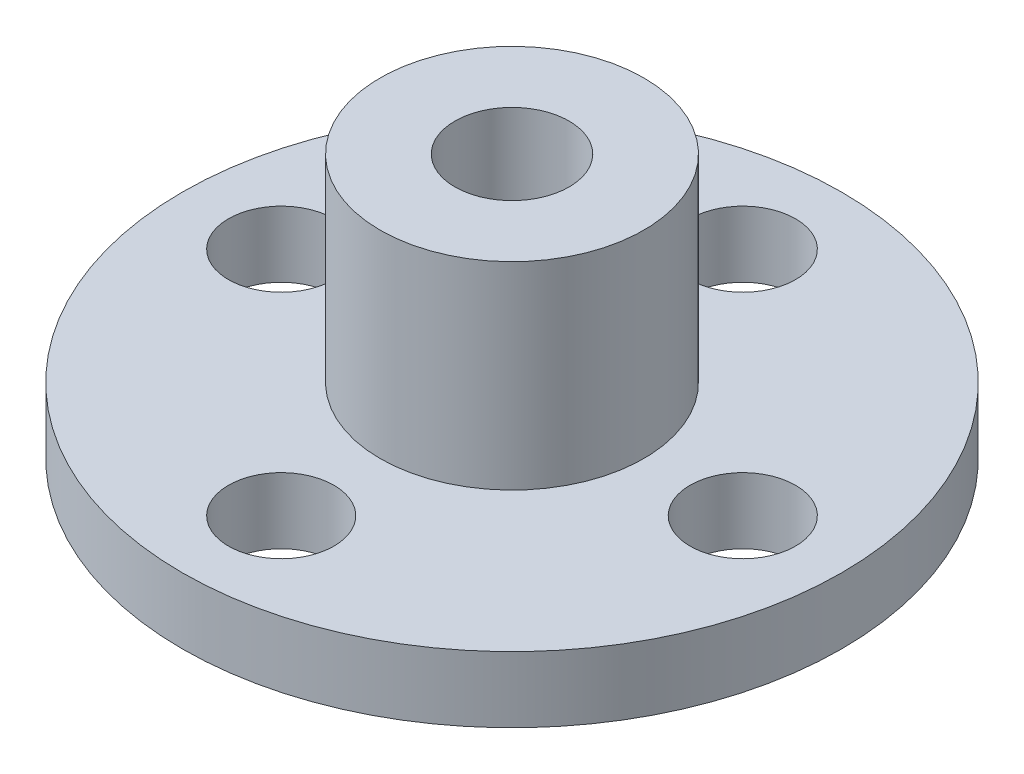
ISO-10303-21;
HEADER;
FILE_DESCRIPTION(('STEP AP214'),'2;1');
FILE_NAME('part.step','',(''),(''),'','','');
FILE_SCHEMA(('AUTOMOTIVE_DESIGN { 1 0 10303 214 1 1 1 1 }'));
ENDSEC;
DATA;
#1=APPLICATION_CONTEXT('core data for automotive mechanical design processes');
#2=APPLICATION_PROTOCOL_DEFINITION('international standard','automotive_design',2000,#1);
#3=PRODUCT_CONTEXT('',#1,'mechanical');
#4=PRODUCT('Part','Part','',(#3));
#5=PRODUCT_RELATED_PRODUCT_CATEGORY('part','',(#4));
#6=PRODUCT_DEFINITION_FORMATION('','',#4);
#7=PRODUCT_DEFINITION_CONTEXT('part definition',#1,'design');
#8=PRODUCT_DEFINITION('design','',#6,#7);
#9=PRODUCT_DEFINITION_SHAPE('','',#8);
#10=(LENGTH_UNIT() NAMED_UNIT(*) SI_UNIT(.MILLI.,.METRE.));
#11=(NAMED_UNIT(*) PLANE_ANGLE_UNIT() SI_UNIT($,.RADIAN.));
#12=(NAMED_UNIT(*) SI_UNIT($,.STERADIAN.) SOLID_ANGLE_UNIT());
#13=UNCERTAINTY_MEASURE_WITH_UNIT(LENGTH_MEASURE(1.E-05),#10,'distance_accuracy_value','');
#14=(GEOMETRIC_REPRESENTATION_CONTEXT(3) GLOBAL_UNCERTAINTY_ASSIGNED_CONTEXT((#13)) GLOBAL_UNIT_ASSIGNED_CONTEXT((#10,
#11,#12)) REPRESENTATION_CONTEXT('',''));
#15=CARTESIAN_POINT('',(0.,0.,0.));
#16=DIRECTION('',(0.,0.,1.));
#17=DIRECTION('',(1.,0.,0.));
#18=AXIS2_PLACEMENT_3D('',#15,#16,#17);
#19=CARTESIAN_POINT('',(0.,12.7,0.));
#20=DIRECTION('',(0.,-1.,0.));
#21=DIRECTION('',(0.,0.,-1.));
#22=AXIS2_PLACEMENT_3D('',#19,#20,#21);
#23=CYLINDRICAL_SURFACE('',#22,6.35);
#24=CARTESIAN_POINT('',(0.,12.7,0.));
#25=DIRECTION('',(0.,1.,0.));
#26=DIRECTION('',(0.,0.,1.));
#27=AXIS2_PLACEMENT_3D('',#24,#25,#26);
#28=CIRCLE('',#27,6.35);
#29=CARTESIAN_POINT('',(0.,12.7,6.35));
#30=VERTEX_POINT('',#29);
#31=EDGE_CURVE('E48',#30,#30,#28,.T.);
#32=ORIENTED_EDGE('',*,*,#31,.F.);
#33=EDGE_LOOP('',(#32));
#34=FACE_BOUND('',#33,.T.);
#35=CARTESIAN_POINT('',(0.,3.175,0.));
#36=DIRECTION('',(0.,-1.,0.));
#37=DIRECTION('',(0.,0.,-1.));
#38=AXIS2_PLACEMENT_3D('',#35,#36,#37);
#39=CIRCLE('',#38,6.35);
#40=CARTESIAN_POINT('',(0.,3.175,-6.35));
#41=VERTEX_POINT('',#40);
#42=EDGE_CURVE('E10',#41,#41,#39,.T.);
#43=ORIENTED_EDGE('',*,*,#42,.F.);
#44=EDGE_LOOP('',(#43));
#45=FACE_BOUND('',#44,.T.);
#46=ADVANCED_FACE('F41',(#34,#45),#23,.T.);
#47=CARTESIAN_POINT('',(0.,12.7,0.));
#48=DIRECTION('',(0.,1.,0.));
#49=DIRECTION('',(0.,0.,1.));
#50=AXIS2_PLACEMENT_3D('',#47,#48,#49);
#51=PLANE('',#50);
#52=ORIENTED_EDGE('',*,*,#31,.T.);
#53=EDGE_LOOP('',(#52));
#54=FACE_BOUND('',#53,.T.);
#55=CARTESIAN_POINT('',(0.,12.7,0.));
#56=DIRECTION('',(0.,1.,0.));
#57=DIRECTION('',(0.,0.,1.));
#58=AXIS2_PLACEMENT_3D('',#55,#56,#57);
#59=CIRCLE('',#58,2.75);
#60=CARTESIAN_POINT('',(0.,12.7,2.75));
#61=VERTEX_POINT('',#60);
#62=EDGE_CURVE('E53',#61,#61,#59,.T.);
#63=ORIENTED_EDGE('',*,*,#62,.F.);
#64=EDGE_LOOP('',(#63));
#65=FACE_BOUND('',#64,.T.);
#66=ADVANCED_FACE('F119',(#54,#65),#51,.T.);
#67=CARTESIAN_POINT('',(0.,0.,0.));
#68=DIRECTION('',(0.,1.,0.));
#69=DIRECTION('',(0.,0.,1.));
#70=AXIS2_PLACEMENT_3D('',#67,#68,#69);
#71=PLANE('',#70);
#72=CARTESIAN_POINT('',(0.,0.,0.));
#73=DIRECTION('',(0.,1.,0.));
#74=DIRECTION('',(0.,0.,1.));
#75=AXIS2_PLACEMENT_3D('',#72,#73,#74);
#76=CIRCLE('',#75,2.75);
#77=CARTESIAN_POINT('',(0.,0.,2.75));
#78=VERTEX_POINT('',#77);
#79=EDGE_CURVE('E58',#78,#78,#76,.T.);
#80=ORIENTED_EDGE('',*,*,#79,.T.);
#81=EDGE_LOOP('',(#80));
#82=FACE_BOUND('',#81,.T.);
#83=CARTESIAN_POINT('',(-11.1125,0.,0.));
#84=DIRECTION('',(0.,-1.,0.));
#85=DIRECTION('',(0.,0.,-1.));
#86=AXIS2_PLACEMENT_3D('',#83,#84,#85);
#87=CIRCLE('',#86,2.54);
#88=CARTESIAN_POINT('',(-11.1125,0.,-2.53999999999999));
#89=VERTEX_POINT('',#88);
#90=EDGE_CURVE('E97',#89,#89,#87,.T.);
#91=ORIENTED_EDGE('',*,*,#90,.F.);
#92=EDGE_LOOP('',(#91));
#93=FACE_BOUND('',#92,.T.);
#94=CARTESIAN_POINT('',(0.,0.,-11.1125));
#95=DIRECTION('',(0.,-1.,0.));
#96=DIRECTION('',(0.,0.,-1.));
#97=AXIS2_PLACEMENT_3D('',#94,#95,#96);
#98=CIRCLE('',#97,2.54);
#99=CARTESIAN_POINT('',(0.,0.,-13.6525));
#100=VERTEX_POINT('',#99);
#101=EDGE_CURVE('E89',#100,#100,#98,.T.);
#102=ORIENTED_EDGE('',*,*,#101,.F.);
#103=EDGE_LOOP('',(#102));
#104=FACE_BOUND('',#103,.T.);
#105=CARTESIAN_POINT('',(11.1125,0.,0.));
#106=DIRECTION('',(0.,-1.,0.));
#107=DIRECTION('',(0.,0.,-1.));
#108=AXIS2_PLACEMENT_3D('',#105,#106,#107);
#109=CIRCLE('',#108,2.54);
#110=CARTESIAN_POINT('',(11.1125,0.,-2.54));
#111=VERTEX_POINT('',#110);
#112=EDGE_CURVE('E81',#111,#111,#109,.T.);
#113=ORIENTED_EDGE('',*,*,#112,.F.);
#114=EDGE_LOOP('',(#113));
#115=FACE_BOUND('',#114,.T.);
#116=CARTESIAN_POINT('',(0.,0.,11.1125));
#117=DIRECTION('',(0.,-1.,0.));
#118=DIRECTION('',(0.,0.,-1.));
#119=AXIS2_PLACEMENT_3D('',#116,#117,#118);
#120=CIRCLE('',#119,2.54);
#121=CARTESIAN_POINT('',(0.,0.,8.5725));
#122=VERTEX_POINT('',#121);
#123=EDGE_CURVE('E73',#122,#122,#120,.T.);
#124=ORIENTED_EDGE('',*,*,#123,.F.);
#125=EDGE_LOOP('',(#124));
#126=FACE_BOUND('',#125,.T.);
#127=CARTESIAN_POINT('',(0.,0.,0.));
#128=DIRECTION('',(0.,-1.,0.));
#129=DIRECTION('',(0.,0.,-1.));
#130=AXIS2_PLACEMENT_3D('',#127,#128,#129);
#131=CIRCLE('',#130,15.875);
#132=CARTESIAN_POINT('',(0.,0.,-15.875));
#133=VERTEX_POINT('',#132);
#134=EDGE_CURVE('E65',#133,#133,#131,.T.);
#135=ORIENTED_EDGE('',*,*,#134,.T.);
#136=EDGE_LOOP('',(#135));
#137=FACE_BOUND('',#136,.T.);
#138=ADVANCED_FACE('F115',(#82,#93,#104,#115,#126,#137),#71,.F.);
#139=CARTESIAN_POINT('',(0.,12.7,0.));
#140=DIRECTION('',(0.,-1.,0.));
#141=DIRECTION('',(0.,0.,-1.));
#142=AXIS2_PLACEMENT_3D('',#139,#140,#141);
#143=CYLINDRICAL_SURFACE('',#142,2.75);
#144=ORIENTED_EDGE('',*,*,#62,.T.);
#145=EDGE_LOOP('',(#144));
#146=FACE_BOUND('',#145,.T.);
#147=ORIENTED_EDGE('',*,*,#79,.F.);
#148=EDGE_LOOP('',(#147));
#149=FACE_BOUND('',#148,.T.);
#150=ADVANCED_FACE('F118',(#146,#149),#143,.F.);
#151=CARTESIAN_POINT('',(0.,3.175,0.));
#152=DIRECTION('',(0.,-1.,0.));
#153=DIRECTION('',(0.,0.,-1.));
#154=AXIS2_PLACEMENT_3D('',#151,#152,#153);
#155=CYLINDRICAL_SURFACE('',#154,15.875);
#156=CARTESIAN_POINT('',(0.,3.175,0.));
#157=DIRECTION('',(0.,-1.,0.));
#158=DIRECTION('',(0.,0.,-1.));
#159=AXIS2_PLACEMENT_3D('',#156,#157,#158);
#160=CIRCLE('',#159,15.875);
#161=CARTESIAN_POINT('',(0.,3.175,-15.875));
#162=VERTEX_POINT('',#161);
#163=EDGE_CURVE('E63',#162,#162,#160,.T.);
#164=ORIENTED_EDGE('',*,*,#163,.T.);
#165=EDGE_LOOP('',(#164));
#166=FACE_BOUND('',#165,.T.);
#167=ORIENTED_EDGE('',*,*,#134,.F.);
#168=EDGE_LOOP('',(#167));
#169=FACE_BOUND('',#168,.T.);
#170=ADVANCED_FACE('F129',(#166,#169),#155,.T.);
#171=CARTESIAN_POINT('',(0.,3.175,0.));
#172=DIRECTION('',(0.,-1.,0.));
#173=DIRECTION('',(0.,0.,-1.));
#174=AXIS2_PLACEMENT_3D('',#171,#172,#173);
#175=PLANE('',#174);
#176=CARTESIAN_POINT('',(-11.1125,3.175,0.));
#177=DIRECTION('',(0.,-1.,0.));
#178=DIRECTION('',(0.,0.,-1.));
#179=AXIS2_PLACEMENT_3D('',#176,#177,#178);
#180=CIRCLE('',#179,2.54);
#181=CARTESIAN_POINT('',(-11.1125,3.175,-2.53999999999999));
#182=VERTEX_POINT('',#181);
#183=EDGE_CURVE('E93',#182,#182,#180,.T.);
#184=ORIENTED_EDGE('',*,*,#183,.T.);
#185=EDGE_LOOP('',(#184));
#186=FACE_BOUND('',#185,.T.);
#187=CARTESIAN_POINT('',(0.,3.175,-11.1125));
#188=DIRECTION('',(0.,-1.,0.));
#189=DIRECTION('',(0.,0.,-1.));
#190=AXIS2_PLACEMENT_3D('',#187,#188,#189);
#191=CIRCLE('',#190,2.54);
#192=CARTESIAN_POINT('',(0.,3.175,-13.6525));
#193=VERTEX_POINT('',#192);
#194=EDGE_CURVE('E85',#193,#193,#191,.T.);
#195=ORIENTED_EDGE('',*,*,#194,.T.);
#196=EDGE_LOOP('',(#195));
#197=FACE_BOUND('',#196,.T.);
#198=CARTESIAN_POINT('',(11.1125,3.175,0.));
#199=DIRECTION('',(0.,-1.,0.));
#200=DIRECTION('',(0.,0.,-1.));
#201=AXIS2_PLACEMENT_3D('',#198,#199,#200);
#202=CIRCLE('',#201,2.54);
#203=CARTESIAN_POINT('',(11.1125,3.175,-2.54));
#204=VERTEX_POINT('',#203);
#205=EDGE_CURVE('E77',#204,#204,#202,.T.);
#206=ORIENTED_EDGE('',*,*,#205,.T.);
#207=EDGE_LOOP('',(#206));
#208=FACE_BOUND('',#207,.T.);
#209=ORIENTED_EDGE('',*,*,#42,.T.);
#210=EDGE_LOOP('',(#209));
#211=FACE_BOUND('',#210,.T.);
#212=CARTESIAN_POINT('',(0.,3.175,11.1125));
#213=DIRECTION('',(0.,-1.,0.));
#214=DIRECTION('',(0.,0.,-1.));
#215=AXIS2_PLACEMENT_3D('',#212,#213,#214);
#216=CIRCLE('',#215,2.54);
#217=CARTESIAN_POINT('',(0.,3.175,8.5725));
#218=VERTEX_POINT('',#217);
#219=EDGE_CURVE('E69',#218,#218,#216,.T.);
#220=ORIENTED_EDGE('',*,*,#219,.T.);
#221=EDGE_LOOP('',(#220));
#222=FACE_BOUND('',#221,.T.);
#223=ORIENTED_EDGE('',*,*,#163,.F.);
#224=EDGE_LOOP('',(#223));
#225=FACE_BOUND('',#224,.T.);
#226=ADVANCED_FACE('F105',(#186,#197,#208,#211,#222,#225),#175,.F.);
#227=CARTESIAN_POINT('',(0.,3.175,11.1125));
#228=DIRECTION('',(0.,-1.,0.));
#229=DIRECTION('',(0.,0.,-1.));
#230=AXIS2_PLACEMENT_3D('',#227,#228,#229);
#231=CYLINDRICAL_SURFACE('',#230,2.54);
#232=ORIENTED_EDGE('',*,*,#219,.F.);
#233=EDGE_LOOP('',(#232));
#234=FACE_BOUND('',#233,.T.);
#235=ORIENTED_EDGE('',*,*,#123,.T.);
#236=EDGE_LOOP('',(#235));
#237=FACE_BOUND('',#236,.T.);
#238=ADVANCED_FACE('F137',(#234,#237),#231,.F.);
#239=CARTESIAN_POINT('',(11.1125,3.175,0.));
#240=DIRECTION('',(0.,-1.,0.));
#241=DIRECTION('',(0.,0.,-1.));
#242=AXIS2_PLACEMENT_3D('',#239,#240,#241);
#243=CYLINDRICAL_SURFACE('',#242,2.54);
#244=ORIENTED_EDGE('',*,*,#205,.F.);
#245=EDGE_LOOP('',(#244));
#246=FACE_BOUND('',#245,.T.);
#247=ORIENTED_EDGE('',*,*,#112,.T.);
#248=EDGE_LOOP('',(#247));
#249=FACE_BOUND('',#248,.T.);
#250=ADVANCED_FACE('F192',(#246,#249),#243,.F.);
#251=CARTESIAN_POINT('',(0.,3.175,-11.1125));
#252=DIRECTION('',(0.,-1.,0.));
#253=DIRECTION('',(0.,0.,-1.));
#254=AXIS2_PLACEMENT_3D('',#251,#252,#253);
#255=CYLINDRICAL_SURFACE('',#254,2.54);
#256=ORIENTED_EDGE('',*,*,#194,.F.);
#257=EDGE_LOOP('',(#256));
#258=FACE_BOUND('',#257,.T.);
#259=ORIENTED_EDGE('',*,*,#101,.T.);
#260=EDGE_LOOP('',(#259));
#261=FACE_BOUND('',#260,.T.);
#262=ADVANCED_FACE('F111',(#258,#261),#255,.F.);
#263=CARTESIAN_POINT('',(-11.1125,3.175,0.));
#264=DIRECTION('',(0.,-1.,0.));
#265=DIRECTION('',(0.,0.,-1.));
#266=AXIS2_PLACEMENT_3D('',#263,#264,#265);
#267=CYLINDRICAL_SURFACE('',#266,2.54);
#268=ORIENTED_EDGE('',*,*,#183,.F.);
#269=EDGE_LOOP('',(#268));
#270=FACE_BOUND('',#269,.T.);
#271=ORIENTED_EDGE('',*,*,#90,.T.);
#272=EDGE_LOOP('',(#271));
#273=FACE_BOUND('',#272,.T.);
#274=ADVANCED_FACE('F108',(#270,#273),#267,.F.);
#275=CLOSED_SHELL('',(#46,#66,#138,#150,#170,#226,#238,#250,#262,#274));
#276=MANIFOLD_SOLID_BREP('B2',#275);
#277=ADVANCED_BREP_SHAPE_REPRESENTATION('',(#18,#276),#14);
#278=SHAPE_DEFINITION_REPRESENTATION(#9,#277);
ENDSEC;
END-ISO-10303-21;
